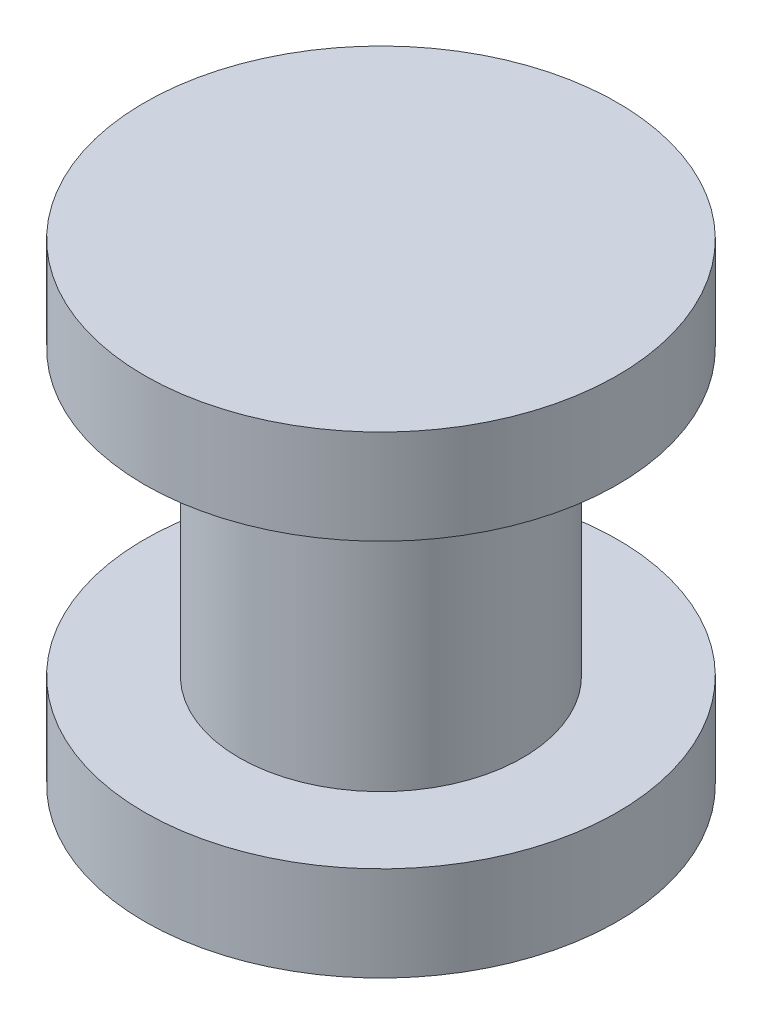
ISO-10303-21;
HEADER;
FILE_DESCRIPTION(('STEP AP214'),'2;1');
FILE_NAME('part.step','',(''),(''),'','','');
FILE_SCHEMA(('AUTOMOTIVE_DESIGN { 1 0 10303 214 1 1 1 1 }'));
ENDSEC;
DATA;
#1=APPLICATION_CONTEXT('core data for automotive mechanical design processes');
#2=APPLICATION_PROTOCOL_DEFINITION('international standard','automotive_design',2000,#1);
#3=PRODUCT_CONTEXT('',#1,'mechanical');
#4=PRODUCT('Part','Part','',(#3));
#5=PRODUCT_RELATED_PRODUCT_CATEGORY('part','',(#4));
#6=PRODUCT_DEFINITION_FORMATION('','',#4);
#7=PRODUCT_DEFINITION_CONTEXT('part definition',#1,'design');
#8=PRODUCT_DEFINITION('design','',#6,#7);
#9=PRODUCT_DEFINITION_SHAPE('','',#8);
#10=(LENGTH_UNIT() NAMED_UNIT(*) SI_UNIT(.MILLI.,.METRE.));
#11=(NAMED_UNIT(*) PLANE_ANGLE_UNIT() SI_UNIT($,.RADIAN.));
#12=(NAMED_UNIT(*) SI_UNIT($,.STERADIAN.) SOLID_ANGLE_UNIT());
#13=UNCERTAINTY_MEASURE_WITH_UNIT(LENGTH_MEASURE(1.E-05),#10,'distance_accuracy_value','');
#14=(GEOMETRIC_REPRESENTATION_CONTEXT(3) GLOBAL_UNCERTAINTY_ASSIGNED_CONTEXT((#13)) GLOBAL_UNIT_ASSIGNED_CONTEXT((#10,
#11,#12)) REPRESENTATION_CONTEXT('',''));
#15=CARTESIAN_POINT('',(0.,0.,0.));
#16=DIRECTION('',(0.,0.,1.));
#17=DIRECTION('',(1.,0.,0.));
#18=AXIS2_PLACEMENT_3D('',#15,#16,#17);
#19=CARTESIAN_POINT('',(-14.7615435905984,19.9486383621148,0.));
#20=DIRECTION('',(0.,-1.,0.));
#21=DIRECTION('',(0.,0.,-1.));
#22=AXIS2_PLACEMENT_3D('',#19,#20,#21);
#23=PLANE('',#22);
#24=CARTESIAN_POINT('',(-14.7615435905984,19.9486383621148,0.));
#25=DIRECTION('',(0.,1.,0.));
#26=DIRECTION('',(0.,0.,1.));
#27=AXIS2_PLACEMENT_3D('',#24,#25,#26);
#28=CIRCLE('',#27,2.5);
#29=CARTESIAN_POINT('',(-14.7615435905984,19.9486383621148,2.5));
#30=VERTEX_POINT('',#29);
#31=EDGE_CURVE('E10',#30,#30,#28,.T.);
#32=ORIENTED_EDGE('',*,*,#31,.F.);
#33=EDGE_LOOP('',(#32));
#34=FACE_BOUND('',#33,.T.);
#35=ADVANCED_FACE('F41',(#34),#23,.T.);
#36=CARTESIAN_POINT('',(-14.7615435905984,24.9486383621148,0.));
#37=DIRECTION('',(0.,1.,0.));
#38=DIRECTION('',(0.,0.,1.));
#39=AXIS2_PLACEMENT_3D('',#36,#37,#38);
#40=CYLINDRICAL_SURFACE('',#39,2.5);
#41=ORIENTED_EDGE('',*,*,#31,.T.);
#42=EDGE_LOOP('',(#41));
#43=FACE_BOUND('',#42,.T.);
#44=CARTESIAN_POINT('',(-14.7615435905984,20.9486383621148,0.));
#45=DIRECTION('',(0.,1.,0.));
#46=DIRECTION('',(0.,0.,1.));
#47=AXIS2_PLACEMENT_3D('',#44,#45,#46);
#48=CIRCLE('',#47,2.5);
#49=CARTESIAN_POINT('',(-14.7615435905984,20.9486383621148,2.5));
#50=VERTEX_POINT('',#49);
#51=EDGE_CURVE('E48',#50,#50,#48,.T.);
#52=ORIENTED_EDGE('',*,*,#51,.F.);
#53=EDGE_LOOP('',(#52));
#54=FACE_BOUND('',#53,.T.);
#55=ADVANCED_FACE('F89',(#43,#54),#40,.T.);
#56=CARTESIAN_POINT('',(-17.2615435905984,20.9486383621148,0.));
#57=DIRECTION('',(0.,1.,0.));
#58=DIRECTION('',(0.,0.,1.));
#59=AXIS2_PLACEMENT_3D('',#56,#57,#58);
#60=PLANE('',#59);
#61=ORIENTED_EDGE('',*,*,#51,.T.);
#62=EDGE_LOOP('',(#61));
#63=FACE_BOUND('',#62,.T.);
#64=CARTESIAN_POINT('',(-14.7615435905984,20.9486383621148,0.));
#65=DIRECTION('',(0.,1.,0.));
#66=DIRECTION('',(0.,0.,1.));
#67=AXIS2_PLACEMENT_3D('',#64,#65,#66);
#68=CIRCLE('',#67,1.5);
#69=CARTESIAN_POINT('',(-14.7615435905984,20.9486383621148,1.5));
#70=VERTEX_POINT('',#69);
#71=EDGE_CURVE('E53',#70,#70,#68,.T.);
#72=ORIENTED_EDGE('',*,*,#71,.F.);
#73=EDGE_LOOP('',(#72));
#74=FACE_BOUND('',#73,.T.);
#75=ADVANCED_FACE('F94',(#63,#74),#60,.T.);
#76=CARTESIAN_POINT('',(-14.7615435905984,24.9486383621148,0.));
#77=DIRECTION('',(0.,1.,0.));
#78=DIRECTION('',(0.,0.,1.));
#79=AXIS2_PLACEMENT_3D('',#76,#77,#78);
#80=CYLINDRICAL_SURFACE('',#79,1.5);
#81=ORIENTED_EDGE('',*,*,#71,.T.);
#82=EDGE_LOOP('',(#81));
#83=FACE_BOUND('',#82,.T.);
#84=CARTESIAN_POINT('',(-14.7615435905984,23.9486383621148,0.));
#85=DIRECTION('',(0.,1.,0.));
#86=DIRECTION('',(0.,0.,1.));
#87=AXIS2_PLACEMENT_3D('',#84,#85,#86);
#88=CIRCLE('',#87,1.5);
#89=CARTESIAN_POINT('',(-14.7615435905984,23.9486383621148,1.5));
#90=VERTEX_POINT('',#89);
#91=EDGE_CURVE('E58',#90,#90,#88,.T.);
#92=ORIENTED_EDGE('',*,*,#91,.F.);
#93=EDGE_LOOP('',(#92));
#94=FACE_BOUND('',#93,.T.);
#95=ADVANCED_FACE('F85',(#83,#94),#80,.T.);
#96=CARTESIAN_POINT('',(-16.2615435905984,23.9486383621148,0.));
#97=DIRECTION('',(0.,-1.,0.));
#98=DIRECTION('',(0.,0.,-1.));
#99=AXIS2_PLACEMENT_3D('',#96,#97,#98);
#100=PLANE('',#99);
#101=ORIENTED_EDGE('',*,*,#91,.T.);
#102=EDGE_LOOP('',(#101));
#103=FACE_BOUND('',#102,.T.);
#104=CARTESIAN_POINT('',(-14.7615435905984,23.9486383621148,0.));
#105=DIRECTION('',(0.,1.,0.));
#106=DIRECTION('',(0.,0.,1.));
#107=AXIS2_PLACEMENT_3D('',#104,#105,#106);
#108=CIRCLE('',#107,2.5);
#109=CARTESIAN_POINT('',(-14.7615435905984,23.9486383621148,2.5));
#110=VERTEX_POINT('',#109);
#111=EDGE_CURVE('E64',#110,#110,#108,.T.);
#112=ORIENTED_EDGE('',*,*,#111,.F.);
#113=EDGE_LOOP('',(#112));
#114=FACE_BOUND('',#113,.T.);
#115=ADVANCED_FACE('F77',(#103,#114),#100,.T.);
#116=CARTESIAN_POINT('',(-14.7615435905984,24.9486383621148,0.));
#117=DIRECTION('',(0.,1.,0.));
#118=DIRECTION('',(0.,0.,1.));
#119=AXIS2_PLACEMENT_3D('',#116,#117,#118);
#120=CYLINDRICAL_SURFACE('',#119,2.5);
#121=ORIENTED_EDGE('',*,*,#111,.T.);
#122=EDGE_LOOP('',(#121));
#123=FACE_BOUND('',#122,.T.);
#124=CARTESIAN_POINT('',(-14.7615435905984,24.9486383621148,0.));
#125=DIRECTION('',(0.,1.,0.));
#126=DIRECTION('',(0.,0.,1.));
#127=AXIS2_PLACEMENT_3D('',#124,#125,#126);
#128=CIRCLE('',#127,2.5);
#129=CARTESIAN_POINT('',(-14.7615435905984,24.9486383621148,2.5));
#130=VERTEX_POINT('',#129);
#131=EDGE_CURVE('E68',#130,#130,#128,.T.);
#132=ORIENTED_EDGE('',*,*,#131,.F.);
#133=EDGE_LOOP('',(#132));
#134=FACE_BOUND('',#133,.T.);
#135=ADVANCED_FACE('F75',(#123,#134),#120,.T.);
#136=CARTESIAN_POINT('',(-14.7615435905984,24.9486383621148,0.));
#137=DIRECTION('',(0.,1.,0.));
#138=DIRECTION('',(0.,0.,1.));
#139=AXIS2_PLACEMENT_3D('',#136,#137,#138);
#140=PLANE('',#139);
#141=ORIENTED_EDGE('',*,*,#131,.T.);
#142=EDGE_LOOP('',(#141));
#143=FACE_BOUND('',#142,.T.);
#144=ADVANCED_FACE('F73',(#143),#140,.T.);
#145=CLOSED_SHELL('',(#35,#55,#75,#95,#115,#135,#144));
#146=MANIFOLD_SOLID_BREP('B2',#145);
#147=ADVANCED_BREP_SHAPE_REPRESENTATION('',(#18,#146),#14);
#148=SHAPE_DEFINITION_REPRESENTATION(#9,#147);
ENDSEC;
END-ISO-10303-21;
